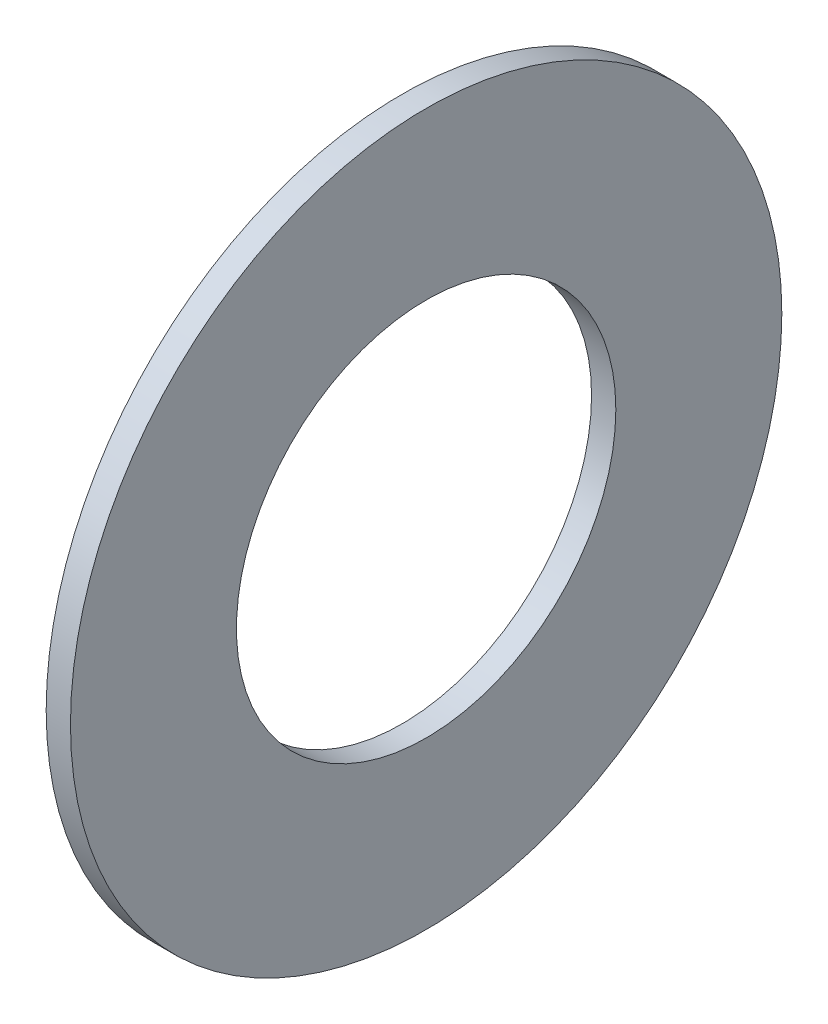
ISO-10303-21;
HEADER;
FILE_DESCRIPTION(('STEP AP214'),'2;1');
FILE_NAME('part.step','',(''),(''),'','','');
FILE_SCHEMA(('AUTOMOTIVE_DESIGN { 1 0 10303 214 1 1 1 1 }'));
ENDSEC;
DATA;
#1=APPLICATION_CONTEXT('core data for automotive mechanical design processes');
#2=APPLICATION_PROTOCOL_DEFINITION('international standard','automotive_design',2000,#1);
#3=PRODUCT_CONTEXT('',#1,'mechanical');
#4=PRODUCT('Part','Part','',(#3));
#5=PRODUCT_RELATED_PRODUCT_CATEGORY('part','',(#4));
#6=PRODUCT_DEFINITION_FORMATION('','',#4);
#7=PRODUCT_DEFINITION_CONTEXT('part definition',#1,'design');
#8=PRODUCT_DEFINITION('design','',#6,#7);
#9=PRODUCT_DEFINITION_SHAPE('','',#8);
#10=(LENGTH_UNIT() NAMED_UNIT(*) SI_UNIT(.MILLI.,.METRE.));
#11=(NAMED_UNIT(*) PLANE_ANGLE_UNIT() SI_UNIT($,.RADIAN.));
#12=(NAMED_UNIT(*) SI_UNIT($,.STERADIAN.) SOLID_ANGLE_UNIT());
#13=UNCERTAINTY_MEASURE_WITH_UNIT(LENGTH_MEASURE(1.E-05),#10,'distance_accuracy_value','');
#14=(GEOMETRIC_REPRESENTATION_CONTEXT(3) GLOBAL_UNCERTAINTY_ASSIGNED_CONTEXT((#13)) GLOBAL_UNIT_ASSIGNED_CONTEXT((#10,
#11,#12)) REPRESENTATION_CONTEXT('',''));
#15=CARTESIAN_POINT('',(0.,0.,0.));
#16=DIRECTION('',(0.,0.,1.));
#17=DIRECTION('',(1.,0.,0.));
#18=AXIS2_PLACEMENT_3D('',#15,#16,#17);
#19=CARTESIAN_POINT('',(0.8128,0.,0.));
#20=DIRECTION('',(1.,0.,0.));
#21=DIRECTION('',(0.,0.,-1.));
#22=AXIS2_PLACEMENT_3D('',#19,#20,#21);
#23=PLANE('',#22);
#24=CARTESIAN_POINT('',(0.8128,0.,0.));
#25=DIRECTION('',(1.,0.,0.));
#26=DIRECTION('',(0.,0.,-1.));
#27=AXIS2_PLACEMENT_3D('',#24,#25,#26);
#28=CIRCLE('',#27,11.90625);
#29=CARTESIAN_POINT('',(0.8128,0.,-11.90625));
#30=VERTEX_POINT('',#29);
#31=EDGE_CURVE('E10',#30,#30,#28,.T.);
#32=ORIENTED_EDGE('',*,*,#31,.T.);
#33=EDGE_LOOP('',(#32));
#34=FACE_BOUND('',#33,.T.);
#35=CARTESIAN_POINT('',(0.8128,0.,0.));
#36=DIRECTION('',(1.,0.,0.));
#37=DIRECTION('',(0.,0.,-1.));
#38=AXIS2_PLACEMENT_3D('',#35,#36,#37);
#39=CIRCLE('',#38,6.35);
#40=CARTESIAN_POINT('',(0.8128,0.,-6.35));
#41=VERTEX_POINT('',#40);
#42=EDGE_CURVE('E54',#41,#41,#39,.T.);
#43=ORIENTED_EDGE('',*,*,#42,.F.);
#44=EDGE_LOOP('',(#43));
#45=FACE_BOUND('',#44,.T.);
#46=ADVANCED_FACE('F43',(#34,#45),#23,.T.);
#47=CARTESIAN_POINT('',(0.,0.,0.));
#48=DIRECTION('',(1.,0.,0.));
#49=DIRECTION('',(0.,0.,-1.));
#50=AXIS2_PLACEMENT_3D('',#47,#48,#49);
#51=PLANE('',#50);
#52=CARTESIAN_POINT('',(0.,0.,0.));
#53=DIRECTION('',(1.,0.,0.));
#54=DIRECTION('',(0.,0.,-1.));
#55=AXIS2_PLACEMENT_3D('',#52,#53,#54);
#56=CIRCLE('',#55,11.90625);
#57=CARTESIAN_POINT('',(0.,0.,-11.90625));
#58=VERTEX_POINT('',#57);
#59=EDGE_CURVE('E50',#58,#58,#56,.T.);
#60=ORIENTED_EDGE('',*,*,#59,.F.);
#61=EDGE_LOOP('',(#60));
#62=FACE_BOUND('',#61,.T.);
#63=CARTESIAN_POINT('',(0.,0.,0.));
#64=DIRECTION('',(1.,0.,0.));
#65=DIRECTION('',(0.,0.,-1.));
#66=AXIS2_PLACEMENT_3D('',#63,#64,#65);
#67=CIRCLE('',#66,6.35);
#68=CARTESIAN_POINT('',(0.,0.,-6.35));
#69=VERTEX_POINT('',#68);
#70=EDGE_CURVE('E58',#69,#69,#67,.T.);
#71=ORIENTED_EDGE('',*,*,#70,.T.);
#72=EDGE_LOOP('',(#71));
#73=FACE_BOUND('',#72,.T.);
#74=ADVANCED_FACE('F64',(#62,#73),#51,.F.);
#75=CARTESIAN_POINT('',(0.8128,0.,0.));
#76=DIRECTION('',(-1.,0.,0.));
#77=DIRECTION('',(0.,0.,1.));
#78=AXIS2_PLACEMENT_3D('',#75,#76,#77);
#79=CYLINDRICAL_SURFACE('',#78,11.90625);
#80=ORIENTED_EDGE('',*,*,#31,.F.);
#81=EDGE_LOOP('',(#80));
#82=FACE_BOUND('',#81,.T.);
#83=ORIENTED_EDGE('',*,*,#59,.T.);
#84=EDGE_LOOP('',(#83));
#85=FACE_BOUND('',#84,.T.);
#86=ADVANCED_FACE('F45',(#82,#85),#79,.T.);
#87=CARTESIAN_POINT('',(0.8128,0.,0.));
#88=DIRECTION('',(-1.,0.,0.));
#89=DIRECTION('',(0.,0.,1.));
#90=AXIS2_PLACEMENT_3D('',#87,#88,#89);
#91=CYLINDRICAL_SURFACE('',#90,6.35);
#92=ORIENTED_EDGE('',*,*,#42,.T.);
#93=EDGE_LOOP('',(#92));
#94=FACE_BOUND('',#93,.T.);
#95=ORIENTED_EDGE('',*,*,#70,.F.);
#96=EDGE_LOOP('',(#95));
#97=FACE_BOUND('',#96,.T.);
#98=ADVANCED_FACE('F66',(#94,#97),#91,.F.);
#99=CLOSED_SHELL('',(#46,#74,#86,#98));
#100=MANIFOLD_SOLID_BREP('B2',#99);
#101=ADVANCED_BREP_SHAPE_REPRESENTATION('',(#18,#100),#14);
#102=SHAPE_DEFINITION_REPRESENTATION(#9,#101);
ENDSEC;
END-ISO-10303-21;
